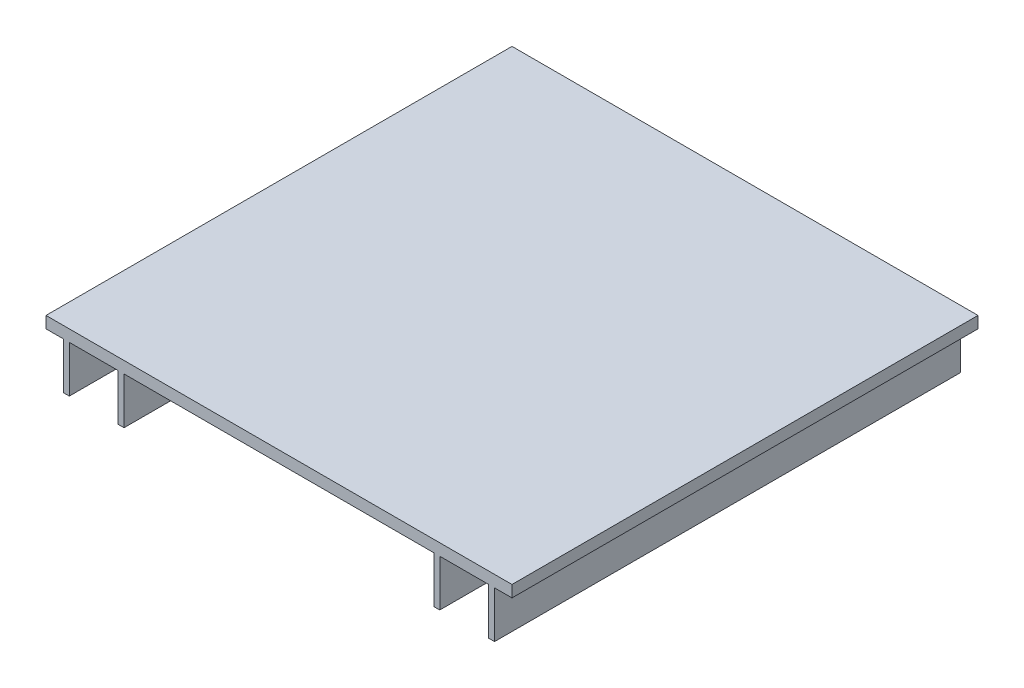
ISO-10303-21;
HEADER;
FILE_DESCRIPTION(('STEP AP214'),'2;1');
FILE_NAME('part.step','',(''),(''),'','','');
FILE_SCHEMA(('AUTOMOTIVE_DESIGN { 1 0 10303 214 1 1 1 1 }'));
ENDSEC;
DATA;
#1=APPLICATION_CONTEXT('core data for automotive mechanical design processes');
#2=APPLICATION_PROTOCOL_DEFINITION('international standard','automotive_design',2000,#1);
#3=PRODUCT_CONTEXT('',#1,'mechanical');
#4=PRODUCT('Part','Part','',(#3));
#5=PRODUCT_RELATED_PRODUCT_CATEGORY('part','',(#4));
#6=PRODUCT_DEFINITION_FORMATION('','',#4);
#7=PRODUCT_DEFINITION_CONTEXT('part definition',#1,'design');
#8=PRODUCT_DEFINITION('design','',#6,#7);
#9=PRODUCT_DEFINITION_SHAPE('','',#8);
#10=(LENGTH_UNIT() NAMED_UNIT(*) SI_UNIT(.MILLI.,.METRE.));
#11=(NAMED_UNIT(*) PLANE_ANGLE_UNIT() SI_UNIT($,.RADIAN.));
#12=(NAMED_UNIT(*) SI_UNIT($,.STERADIAN.) SOLID_ANGLE_UNIT());
#13=UNCERTAINTY_MEASURE_WITH_UNIT(LENGTH_MEASURE(1.E-05),#10,'distance_accuracy_value','');
#14=(GEOMETRIC_REPRESENTATION_CONTEXT(3) GLOBAL_UNCERTAINTY_ASSIGNED_CONTEXT((#13)) GLOBAL_UNIT_ASSIGNED_CONTEXT((#10,
#11,#12)) REPRESENTATION_CONTEXT('',''));
#15=CARTESIAN_POINT('',(0.,0.,0.));
#16=DIRECTION('',(0.,0.,1.));
#17=DIRECTION('',(1.,0.,0.));
#18=AXIS2_PLACEMENT_3D('',#15,#16,#17);
#19=CARTESIAN_POINT('',(0.,0.,0.));
#20=DIRECTION('',(0.,1.,0.));
#21=DIRECTION('',(0.,0.,1.));
#22=AXIS2_PLACEMENT_3D('',#19,#20,#21);
#23=PLANE('',#22);
#24=DIRECTION('',(-1.,0.,0.));
#25=VECTOR('',#24,1.);
#26=CARTESIAN_POINT('',(-100.,0.,-100.));
#27=LINE('',#26,#25);
#28=CARTESIAN_POINT('',(90.,0.,-100.));
#29=VERTEX_POINT('',#28);
#30=CARTESIAN_POINT('',(69.,0.,-100.));
#31=VERTEX_POINT('',#30);
#32=EDGE_CURVE('E360',#29,#31,#27,.T.);
#33=ORIENTED_EDGE('',*,*,#32,.F.);
#34=DIRECTION('',(0.,0.,1.));
#35=VECTOR('',#34,1.);
#36=CARTESIAN_POINT('',(90.,0.,100.));
#37=LINE('',#36,#35);
#38=CARTESIAN_POINT('',(90.,0.,100.));
#39=VERTEX_POINT('',#38);
#40=EDGE_CURVE('E220',#29,#39,#37,.T.);
#41=ORIENTED_EDGE('',*,*,#40,.T.);
#42=DIRECTION('',(1.,0.,0.));
#43=VECTOR('',#42,1.);
#44=CARTESIAN_POINT('',(-100.,0.,100.));
#45=LINE('',#44,#43);
#46=CARTESIAN_POINT('',(69.,0.,100.));
#47=VERTEX_POINT('',#46);
#48=EDGE_CURVE('E191',#47,#39,#45,.T.);
#49=ORIENTED_EDGE('',*,*,#48,.F.);
#50=DIRECTION('',(0.,0.,-1.));
#51=VECTOR('',#50,1.);
#52=CARTESIAN_POINT('',(69.,0.,100.));
#53=LINE('',#52,#51);
#54=EDGE_CURVE('E69',#47,#31,#53,.T.);
#55=ORIENTED_EDGE('',*,*,#54,.T.);
#56=EDGE_LOOP('',(#33,#41,#49,#55));
#57=FACE_BOUND('',#56,.T.);
#58=ADVANCED_FACE('F45',(#57),#23,.F.);
#59=CARTESIAN_POINT('',(66.5,0.,-100.));
#60=VERTEX_POINT('',#59);
#61=CARTESIAN_POINT('',(-66.5,0.,-100.));
#62=VERTEX_POINT('',#61);
#63=EDGE_CURVE('E432',#60,#62,#27,.T.);
#64=ORIENTED_EDGE('',*,*,#63,.F.);
#65=DIRECTION('',(0.,0.,1.));
#66=VECTOR('',#65,1.);
#67=CARTESIAN_POINT('',(66.5,0.,-100.));
#68=LINE('',#67,#66);
#69=CARTESIAN_POINT('',(66.5,0.,100.));
#70=VERTEX_POINT('',#69);
#71=EDGE_CURVE('E197',#60,#70,#68,.T.);
#72=ORIENTED_EDGE('',*,*,#71,.T.);
#73=CARTESIAN_POINT('',(-66.5,0.,100.));
#74=VERTEX_POINT('',#73);
#75=EDGE_CURVE('E368',#74,#70,#45,.T.);
#76=ORIENTED_EDGE('',*,*,#75,.F.);
#77=DIRECTION('',(0.,0.,1.));
#78=VECTOR('',#77,1.);
#79=CARTESIAN_POINT('',(-66.5,0.,-100.));
#80=LINE('',#79,#78);
#81=EDGE_CURVE('E304',#62,#74,#80,.T.);
#82=ORIENTED_EDGE('',*,*,#81,.F.);
#83=EDGE_LOOP('',(#64,#72,#76,#82));
#84=FACE_BOUND('',#83,.T.);
#85=ADVANCED_FACE('F431',(#84),#23,.F.);
#86=DIRECTION('',(0.,0.,-1.));
#87=VECTOR('',#86,1.);
#88=CARTESIAN_POINT('',(-92.5,0.,-100.));
#89=LINE('',#88,#87);
#90=CARTESIAN_POINT('',(-92.5,0.,100.));
#91=VERTEX_POINT('',#90);
#92=CARTESIAN_POINT('',(-92.5,0.,-100.));
#93=VERTEX_POINT('',#92);
#94=EDGE_CURVE('E283',#91,#93,#89,.T.);
#95=ORIENTED_EDGE('',*,*,#94,.F.);
#96=CARTESIAN_POINT('',(-100.,0.,100.));
#97=VERTEX_POINT('',#96);
#98=EDGE_CURVE('E341',#97,#91,#45,.T.);
#99=ORIENTED_EDGE('',*,*,#98,.F.);
#100=DIRECTION('',(0.,0.,1.));
#101=VECTOR('',#100,1.);
#102=CARTESIAN_POINT('',(-100.,0.,-100.));
#103=LINE('',#102,#101);
#104=CARTESIAN_POINT('',(-100.,0.,-100.));
#105=VERTEX_POINT('',#104);
#106=EDGE_CURVE('E359',#105,#97,#103,.T.);
#107=ORIENTED_EDGE('',*,*,#106,.F.);
#108=EDGE_CURVE('E354',#93,#105,#27,.T.);
#109=ORIENTED_EDGE('',*,*,#108,.F.);
#110=EDGE_LOOP('',(#95,#99,#107,#109));
#111=FACE_BOUND('',#110,.T.);
#112=ADVANCED_FACE('F388',(#111),#23,.F.);
#113=DIRECTION('',(0.,0.,1.));
#114=VECTOR('',#113,1.);
#115=CARTESIAN_POINT('',(-90.,0.,100.));
#116=LINE('',#115,#114);
#117=CARTESIAN_POINT('',(-90.,0.,-100.));
#118=VERTEX_POINT('',#117);
#119=CARTESIAN_POINT('',(-90.,0.,100.));
#120=VERTEX_POINT('',#119);
#121=EDGE_CURVE('E279',#118,#120,#116,.T.);
#122=ORIENTED_EDGE('',*,*,#121,.F.);
#123=CARTESIAN_POINT('',(-69.,0.,-100.));
#124=VERTEX_POINT('',#123);
#125=EDGE_CURVE('E361',#124,#118,#27,.T.);
#126=ORIENTED_EDGE('',*,*,#125,.F.);
#127=DIRECTION('',(0.,0.,-1.));
#128=VECTOR('',#127,1.);
#129=CARTESIAN_POINT('',(-69.,0.,100.));
#130=LINE('',#129,#128);
#131=CARTESIAN_POINT('',(-69.,0.,100.));
#132=VERTEX_POINT('',#131);
#133=EDGE_CURVE('E287',#132,#124,#130,.T.);
#134=ORIENTED_EDGE('',*,*,#133,.F.);
#135=EDGE_CURVE('E367',#120,#132,#45,.T.);
#136=ORIENTED_EDGE('',*,*,#135,.F.);
#137=EDGE_LOOP('',(#122,#126,#134,#136));
#138=FACE_BOUND('',#137,.T.);
#139=ADVANCED_FACE('F415',(#138),#23,.F.);
#140=CARTESIAN_POINT('',(92.5,0.,100.));
#141=VERTEX_POINT('',#140);
#142=CARTESIAN_POINT('',(100.,0.,100.));
#143=VERTEX_POINT('',#142);
#144=EDGE_CURVE('E364',#141,#143,#45,.T.);
#145=ORIENTED_EDGE('',*,*,#144,.F.);
#146=DIRECTION('',(0.,0.,-1.));
#147=VECTOR('',#146,1.);
#148=CARTESIAN_POINT('',(92.5,0.,-100.));
#149=LINE('',#148,#147);
#150=CARTESIAN_POINT('',(92.5,0.,-100.));
#151=VERTEX_POINT('',#150);
#152=EDGE_CURVE('E61',#141,#151,#149,.T.);
#153=ORIENTED_EDGE('',*,*,#152,.T.);
#154=CARTESIAN_POINT('',(100.,0.,-100.));
#155=VERTEX_POINT('',#154);
#156=EDGE_CURVE('E355',#155,#151,#27,.T.);
#157=ORIENTED_EDGE('',*,*,#156,.F.);
#158=DIRECTION('',(0.,0.,-1.));
#159=VECTOR('',#158,1.);
#160=CARTESIAN_POINT('',(100.,0.,-100.));
#161=LINE('',#160,#159);
#162=EDGE_CURVE('E335',#143,#155,#161,.T.);
#163=ORIENTED_EDGE('',*,*,#162,.F.);
#164=EDGE_LOOP('',(#145,#153,#157,#163));
#165=FACE_BOUND('',#164,.T.);
#166=ADVANCED_FACE('F402',(#165),#23,.F.);
#167=CARTESIAN_POINT('',(100.,5.,-100.));
#168=DIRECTION('',(-1.,0.,0.));
#169=DIRECTION('',(0.,0.,1.));
#170=AXIS2_PLACEMENT_3D('',#167,#168,#169);
#171=PLANE('',#170);
#172=ORIENTED_EDGE('',*,*,#162,.T.);
#173=DIRECTION('',(0.,-1.,0.));
#174=VECTOR('',#173,1.);
#175=CARTESIAN_POINT('',(100.,5.,-100.));
#176=LINE('',#175,#174);
#177=CARTESIAN_POINT('',(100.,5.,-100.));
#178=VERTEX_POINT('',#177);
#179=EDGE_CURVE('E11',#178,#155,#176,.T.);
#180=ORIENTED_EDGE('',*,*,#179,.F.);
#181=DIRECTION('',(0.,0.,-1.));
#182=VECTOR('',#181,1.);
#183=CARTESIAN_POINT('',(100.,5.,-100.));
#184=LINE('',#183,#182);
#185=CARTESIAN_POINT('',(100.,5.,100.));
#186=VERTEX_POINT('',#185);
#187=EDGE_CURVE('E336',#186,#178,#184,.T.);
#188=ORIENTED_EDGE('',*,*,#187,.F.);
#189=DIRECTION('',(0.,-1.,0.));
#190=VECTOR('',#189,1.);
#191=CARTESIAN_POINT('',(100.,5.,100.));
#192=LINE('',#191,#190);
#193=EDGE_CURVE('E350',#186,#143,#192,.T.);
#194=ORIENTED_EDGE('',*,*,#193,.T.);
#195=EDGE_LOOP('',(#172,#180,#188,#194));
#196=FACE_BOUND('',#195,.T.);
#197=ADVANCED_FACE('F47',(#196),#171,.F.);
#198=CARTESIAN_POINT('',(-100.,5.,-100.));
#199=DIRECTION('',(0.,0.,1.));
#200=DIRECTION('',(1.,0.,0.));
#201=AXIS2_PLACEMENT_3D('',#198,#199,#200);
#202=PLANE('',#201);
#203=ORIENTED_EDGE('',*,*,#156,.T.);
#204=DIRECTION('',(0.,1.,0.));
#205=VECTOR('',#204,1.);
#206=CARTESIAN_POINT('',(92.5,-20.,-100.));
#207=LINE('',#206,#205);
#208=CARTESIAN_POINT('',(92.5,-20.,-100.));
#209=VERTEX_POINT('',#208);
#210=EDGE_CURVE('E227',#209,#151,#207,.T.);
#211=ORIENTED_EDGE('',*,*,#210,.F.);
#212=DIRECTION('',(-1.,0.,0.));
#213=VECTOR('',#212,1.);
#214=CARTESIAN_POINT('',(92.5,-20.,-100.));
#215=LINE('',#214,#213);
#216=CARTESIAN_POINT('',(90.,-20.,-100.));
#217=VERTEX_POINT('',#216);
#218=EDGE_CURVE('E212',#209,#217,#215,.T.);
#219=ORIENTED_EDGE('',*,*,#218,.T.);
#220=DIRECTION('',(0.,1.,0.));
#221=VECTOR('',#220,1.);
#222=CARTESIAN_POINT('',(90.,-20.,-100.));
#223=LINE('',#222,#221);
#224=EDGE_CURVE('E198',#217,#29,#223,.T.);
#225=ORIENTED_EDGE('',*,*,#224,.T.);
#226=ORIENTED_EDGE('',*,*,#32,.T.);
#227=DIRECTION('',(0.,1.,0.));
#228=VECTOR('',#227,1.);
#229=CARTESIAN_POINT('',(69.,-20.,-100.));
#230=LINE('',#229,#228);
#231=CARTESIAN_POINT('',(69.,-20.,-100.));
#232=VERTEX_POINT('',#231);
#233=EDGE_CURVE('E256',#232,#31,#230,.T.);
#234=ORIENTED_EDGE('',*,*,#233,.F.);
#235=DIRECTION('',(-1.,0.,0.));
#236=VECTOR('',#235,1.);
#237=CARTESIAN_POINT('',(69.,-20.,-100.));
#238=LINE('',#237,#236);
#239=CARTESIAN_POINT('',(66.5,-20.,-100.));
#240=VERTEX_POINT('',#239);
#241=EDGE_CURVE('E240',#232,#240,#238,.T.);
#242=ORIENTED_EDGE('',*,*,#241,.T.);
#243=DIRECTION('',(0.,1.,0.));
#244=VECTOR('',#243,1.);
#245=CARTESIAN_POINT('',(66.5,-20.,-100.));
#246=LINE('',#245,#244);
#247=EDGE_CURVE('E259',#240,#60,#246,.T.);
#248=ORIENTED_EDGE('',*,*,#247,.T.);
#249=ORIENTED_EDGE('',*,*,#63,.T.);
#250=DIRECTION('',(0.,1.,0.));
#251=VECTOR('',#250,1.);
#252=CARTESIAN_POINT('',(-66.5,-20.,-100.));
#253=LINE('',#252,#251);
#254=CARTESIAN_POINT('',(-66.5,-20.,-100.));
#255=VERTEX_POINT('',#254);
#256=EDGE_CURVE('E323',#255,#62,#253,.T.);
#257=ORIENTED_EDGE('',*,*,#256,.F.);
#258=DIRECTION('',(1.,0.,0.));
#259=VECTOR('',#258,1.);
#260=CARTESIAN_POINT('',(-69.,-20.,-100.));
#261=LINE('',#260,#259);
#262=CARTESIAN_POINT('',(-69.,-20.,-100.));
#263=VERTEX_POINT('',#262);
#264=EDGE_CURVE('E307',#263,#255,#261,.T.);
#265=ORIENTED_EDGE('',*,*,#264,.F.);
#266=DIRECTION('',(0.,1.,0.));
#267=VECTOR('',#266,1.);
#268=CARTESIAN_POINT('',(-69.,-20.,-100.));
#269=LINE('',#268,#267);
#270=EDGE_CURVE('E327',#263,#124,#269,.T.);
#271=ORIENTED_EDGE('',*,*,#270,.T.);
#272=ORIENTED_EDGE('',*,*,#125,.T.);
#273=DIRECTION('',(0.,1.,0.));
#274=VECTOR('',#273,1.);
#275=CARTESIAN_POINT('',(-90.,-20.,-100.));
#276=LINE('',#275,#274);
#277=CARTESIAN_POINT('',(-90.,-20.,-100.));
#278=VERTEX_POINT('',#277);
#279=EDGE_CURVE('E272',#278,#118,#276,.T.);
#280=ORIENTED_EDGE('',*,*,#279,.F.);
#281=DIRECTION('',(1.,0.,0.));
#282=VECTOR('',#281,1.);
#283=CARTESIAN_POINT('',(-92.5,-20.,-100.));
#284=LINE('',#283,#282);
#285=CARTESIAN_POINT('',(-92.5,-20.,-100.));
#286=VERTEX_POINT('',#285);
#287=EDGE_CURVE('E290',#286,#278,#284,.T.);
#288=ORIENTED_EDGE('',*,*,#287,.F.);
#289=DIRECTION('',(0.,1.,0.));
#290=VECTOR('',#289,1.);
#291=CARTESIAN_POINT('',(-92.5,-20.,-100.));
#292=LINE('',#291,#290);
#293=EDGE_CURVE('E268',#286,#93,#292,.T.);
#294=ORIENTED_EDGE('',*,*,#293,.T.);
#295=ORIENTED_EDGE('',*,*,#108,.T.);
#296=DIRECTION('',(0.,-1.,0.));
#297=VECTOR('',#296,1.);
#298=CARTESIAN_POINT('',(-100.,5.,-100.));
#299=LINE('',#298,#297);
#300=CARTESIAN_POINT('',(-100.,5.,-100.));
#301=VERTEX_POINT('',#300);
#302=EDGE_CURVE('E54',#301,#105,#299,.T.);
#303=ORIENTED_EDGE('',*,*,#302,.F.);
#304=DIRECTION('',(-1.,0.,0.));
#305=VECTOR('',#304,1.);
#306=CARTESIAN_POINT('',(-100.,5.,-100.));
#307=LINE('',#306,#305);
#308=EDGE_CURVE('E340',#178,#301,#307,.T.);
#309=ORIENTED_EDGE('',*,*,#308,.F.);
#310=ORIENTED_EDGE('',*,*,#179,.T.);
#311=EDGE_LOOP('',(#203,#211,#219,#225,#226,#234,#242,#248,#249,#257,#265,#271,#272,#280,#288,
#294,#295,#303,#309,#310));
#312=FACE_BOUND('',#311,.T.);
#313=ADVANCED_FACE('F397',(#312),#202,.F.);
#314=CARTESIAN_POINT('',(-100.,5.,-100.));
#315=DIRECTION('',(1.,0.,0.));
#316=DIRECTION('',(0.,0.,-1.));
#317=AXIS2_PLACEMENT_3D('',#314,#315,#316);
#318=PLANE('',#317);
#319=ORIENTED_EDGE('',*,*,#106,.T.);
#320=DIRECTION('',(0.,-1.,0.));
#321=VECTOR('',#320,1.);
#322=CARTESIAN_POINT('',(-100.,5.,100.));
#323=LINE('',#322,#321);
#324=CARTESIAN_POINT('',(-100.,5.,100.));
#325=VERTEX_POINT('',#324);
#326=EDGE_CURVE('E372',#325,#97,#323,.T.);
#327=ORIENTED_EDGE('',*,*,#326,.F.);
#328=DIRECTION('',(0.,0.,1.));
#329=VECTOR('',#328,1.);
#330=CARTESIAN_POINT('',(-100.,5.,-100.));
#331=LINE('',#330,#329);
#332=EDGE_CURVE('E344',#301,#325,#331,.T.);
#333=ORIENTED_EDGE('',*,*,#332,.F.);
#334=ORIENTED_EDGE('',*,*,#302,.T.);
#335=EDGE_LOOP('',(#319,#327,#333,#334));
#336=FACE_BOUND('',#335,.T.);
#337=ADVANCED_FACE('F381',(#336),#318,.F.);
#338=CARTESIAN_POINT('',(-100.,5.,100.));
#339=DIRECTION('',(0.,0.,-1.));
#340=DIRECTION('',(-1.,0.,0.));
#341=AXIS2_PLACEMENT_3D('',#338,#339,#340);
#342=PLANE('',#341);
#343=ORIENTED_EDGE('',*,*,#98,.T.);
#344=DIRECTION('',(0.,1.,0.));
#345=VECTOR('',#344,1.);
#346=CARTESIAN_POINT('',(-92.5,-20.,100.));
#347=LINE('',#346,#345);
#348=CARTESIAN_POINT('',(-92.5,-20.,100.));
#349=VERTEX_POINT('',#348);
#350=EDGE_CURVE('E265',#349,#91,#347,.T.);
#351=ORIENTED_EDGE('',*,*,#350,.F.);
#352=DIRECTION('',(-1.,0.,0.));
#353=VECTOR('',#352,1.);
#354=CARTESIAN_POINT('',(-92.5,-20.,100.));
#355=LINE('',#354,#353);
#356=CARTESIAN_POINT('',(-90.,-20.,100.));
#357=VERTEX_POINT('',#356);
#358=EDGE_CURVE('E284',#357,#349,#355,.T.);
#359=ORIENTED_EDGE('',*,*,#358,.F.);
#360=DIRECTION('',(0.,1.,0.));
#361=VECTOR('',#360,1.);
#362=CARTESIAN_POINT('',(-90.,-20.,100.));
#363=LINE('',#362,#361);
#364=EDGE_CURVE('E275',#357,#120,#363,.T.);
#365=ORIENTED_EDGE('',*,*,#364,.T.);
#366=ORIENTED_EDGE('',*,*,#135,.T.);
#367=DIRECTION('',(0.,1.,0.));
#368=VECTOR('',#367,1.);
#369=CARTESIAN_POINT('',(-69.,-20.,100.));
#370=LINE('',#369,#368);
#371=CARTESIAN_POINT('',(-69.,-20.,100.));
#372=VERTEX_POINT('',#371);
#373=EDGE_CURVE('E331',#372,#132,#370,.T.);
#374=ORIENTED_EDGE('',*,*,#373,.F.);
#375=DIRECTION('',(-1.,0.,0.));
#376=VECTOR('',#375,1.);
#377=CARTESIAN_POINT('',(-66.5,-20.,100.));
#378=LINE('',#377,#376);
#379=CARTESIAN_POINT('',(-66.5,-20.,100.));
#380=VERTEX_POINT('',#379);
#381=EDGE_CURVE('E299',#380,#372,#378,.T.);
#382=ORIENTED_EDGE('',*,*,#381,.F.);
#383=DIRECTION('',(0.,1.,0.));
#384=VECTOR('',#383,1.);
#385=CARTESIAN_POINT('',(-66.5,-20.,100.));
#386=LINE('',#385,#384);
#387=EDGE_CURVE('E313',#380,#74,#386,.T.);
#388=ORIENTED_EDGE('',*,*,#387,.T.);
#389=ORIENTED_EDGE('',*,*,#75,.T.);
#390=DIRECTION('',(0.,1.,0.));
#391=VECTOR('',#390,1.);
#392=CARTESIAN_POINT('',(66.5,-20.,100.));
#393=LINE('',#392,#391);
#394=CARTESIAN_POINT('',(66.5,-20.,100.));
#395=VERTEX_POINT('',#394);
#396=EDGE_CURVE('E262',#395,#70,#393,.T.);
#397=ORIENTED_EDGE('',*,*,#396,.F.);
#398=DIRECTION('',(1.,0.,0.));
#399=VECTOR('',#398,1.);
#400=CARTESIAN_POINT('',(66.5,-20.,100.));
#401=LINE('',#400,#399);
#402=CARTESIAN_POINT('',(69.,-20.,100.));
#403=VERTEX_POINT('',#402);
#404=EDGE_CURVE('E232',#395,#403,#401,.T.);
#405=ORIENTED_EDGE('',*,*,#404,.T.);
#406=DIRECTION('',(0.,1.,0.));
#407=VECTOR('',#406,1.);
#408=CARTESIAN_POINT('',(69.,-20.,100.));
#409=LINE('',#408,#407);
#410=EDGE_CURVE('E248',#403,#47,#409,.T.);
#411=ORIENTED_EDGE('',*,*,#410,.T.);
#412=ORIENTED_EDGE('',*,*,#48,.T.);
#413=DIRECTION('',(0.,1.,0.));
#414=VECTOR('',#413,1.);
#415=CARTESIAN_POINT('',(90.,-20.,100.));
#416=LINE('',#415,#414);
#417=CARTESIAN_POINT('',(90.,-20.,100.));
#418=VERTEX_POINT('',#417);
#419=EDGE_CURVE('E184',#418,#39,#416,.T.);
#420=ORIENTED_EDGE('',*,*,#419,.F.);
#421=DIRECTION('',(1.,0.,0.));
#422=VECTOR('',#421,1.);
#423=CARTESIAN_POINT('',(92.5,-20.,100.));
#424=LINE('',#423,#422);
#425=CARTESIAN_POINT('',(92.5,-20.,100.));
#426=VERTEX_POINT('',#425);
#427=EDGE_CURVE('E188',#418,#426,#424,.T.);
#428=ORIENTED_EDGE('',*,*,#427,.T.);
#429=DIRECTION('',(0.,1.,0.));
#430=VECTOR('',#429,1.);
#431=CARTESIAN_POINT('',(92.5,-20.,100.));
#432=LINE('',#431,#430);
#433=EDGE_CURVE('E219',#426,#141,#432,.T.);
#434=ORIENTED_EDGE('',*,*,#433,.T.);
#435=ORIENTED_EDGE('',*,*,#144,.T.);
#436=ORIENTED_EDGE('',*,*,#193,.F.);
#437=DIRECTION('',(1.,0.,0.));
#438=VECTOR('',#437,1.);
#439=CARTESIAN_POINT('',(-100.,5.,100.));
#440=LINE('',#439,#438);
#441=EDGE_CURVE('E347',#325,#186,#440,.T.);
#442=ORIENTED_EDGE('',*,*,#441,.F.);
#443=ORIENTED_EDGE('',*,*,#326,.T.);
#444=EDGE_LOOP('',(#343,#351,#359,#365,#366,#374,#382,#388,#389,#397,#405,#411,#412,#420,#428,
#434,#435,#436,#442,#443));
#445=FACE_BOUND('',#444,.T.);
#446=ADVANCED_FACE('F187',(#445),#342,.F.);
#447=CARTESIAN_POINT('',(0.,5.,0.));
#448=DIRECTION('',(0.,1.,0.));
#449=DIRECTION('',(0.,0.,1.));
#450=AXIS2_PLACEMENT_3D('',#447,#448,#449);
#451=PLANE('',#450);
#452=ORIENTED_EDGE('',*,*,#187,.T.);
#453=ORIENTED_EDGE('',*,*,#308,.T.);
#454=ORIENTED_EDGE('',*,*,#332,.T.);
#455=ORIENTED_EDGE('',*,*,#441,.T.);
#456=EDGE_LOOP('',(#452,#453,#454,#455));
#457=FACE_BOUND('',#456,.T.);
#458=ADVANCED_FACE('F395',(#457),#451,.T.);
#459=CARTESIAN_POINT('',(-69.,-20.,100.));
#460=DIRECTION('',(1.,0.,0.));
#461=DIRECTION('',(0.,0.,-1.));
#462=AXIS2_PLACEMENT_3D('',#459,#460,#461);
#463=PLANE('',#462);
#464=ORIENTED_EDGE('',*,*,#133,.T.);
#465=ORIENTED_EDGE('',*,*,#270,.F.);
#466=DIRECTION('',(0.,0.,-1.));
#467=VECTOR('',#466,1.);
#468=CARTESIAN_POINT('',(-69.,-20.,100.));
#469=LINE('',#468,#467);
#470=EDGE_CURVE('E303',#372,#263,#469,.T.);
#471=ORIENTED_EDGE('',*,*,#470,.F.);
#472=ORIENTED_EDGE('',*,*,#373,.T.);
#473=EDGE_LOOP('',(#464,#465,#471,#472));
#474=FACE_BOUND('',#473,.T.);
#475=ADVANCED_FACE('F419',(#474),#463,.F.);
#476=CARTESIAN_POINT('',(-66.5,-20.,-100.));
#477=DIRECTION('',(-1.,0.,0.));
#478=DIRECTION('',(0.,0.,1.));
#479=AXIS2_PLACEMENT_3D('',#476,#477,#478);
#480=PLANE('',#479);
#481=ORIENTED_EDGE('',*,*,#81,.T.);
#482=ORIENTED_EDGE('',*,*,#387,.F.);
#483=DIRECTION('',(0.,0.,1.));
#484=VECTOR('',#483,1.);
#485=CARTESIAN_POINT('',(-66.5,-20.,-100.));
#486=LINE('',#485,#484);
#487=EDGE_CURVE('E310',#255,#380,#486,.T.);
#488=ORIENTED_EDGE('',*,*,#487,.F.);
#489=ORIENTED_EDGE('',*,*,#256,.T.);
#490=EDGE_LOOP('',(#481,#482,#488,#489));
#491=FACE_BOUND('',#490,.T.);
#492=ADVANCED_FACE('F426',(#491),#480,.F.);
#493=CARTESIAN_POINT('',(0.,-20.,0.));
#494=DIRECTION('',(0.,-1.,0.));
#495=DIRECTION('',(0.,0.,-1.));
#496=AXIS2_PLACEMENT_3D('',#493,#494,#495);
#497=PLANE('',#496);
#498=ORIENTED_EDGE('',*,*,#381,.T.);
#499=ORIENTED_EDGE('',*,*,#470,.T.);
#500=ORIENTED_EDGE('',*,*,#264,.T.);
#501=ORIENTED_EDGE('',*,*,#487,.T.);
#502=EDGE_LOOP('',(#498,#499,#500,#501));
#503=FACE_BOUND('',#502,.T.);
#504=ADVANCED_FACE('F422',(#503),#497,.T.);
#505=CARTESIAN_POINT('',(-92.5,-20.,-100.));
#506=DIRECTION('',(1.,0.,0.));
#507=DIRECTION('',(0.,0.,-1.));
#508=AXIS2_PLACEMENT_3D('',#505,#506,#507);
#509=PLANE('',#508);
#510=ORIENTED_EDGE('',*,*,#94,.T.);
#511=ORIENTED_EDGE('',*,*,#293,.F.);
#512=DIRECTION('',(0.,0.,-1.));
#513=VECTOR('',#512,1.);
#514=CARTESIAN_POINT('',(-92.5,-20.,-100.));
#515=LINE('',#514,#513);
#516=EDGE_CURVE('E293',#349,#286,#515,.T.);
#517=ORIENTED_EDGE('',*,*,#516,.F.);
#518=ORIENTED_EDGE('',*,*,#350,.T.);
#519=EDGE_LOOP('',(#510,#511,#517,#518));
#520=FACE_BOUND('',#519,.T.);
#521=ADVANCED_FACE('F453',(#520),#509,.F.);
#522=CARTESIAN_POINT('',(-90.,-20.,100.));
#523=DIRECTION('',(-1.,0.,0.));
#524=DIRECTION('',(0.,0.,1.));
#525=AXIS2_PLACEMENT_3D('',#522,#523,#524);
#526=PLANE('',#525);
#527=ORIENTED_EDGE('',*,*,#121,.T.);
#528=ORIENTED_EDGE('',*,*,#364,.F.);
#529=DIRECTION('',(0.,0.,1.));
#530=VECTOR('',#529,1.);
#531=CARTESIAN_POINT('',(-90.,-20.,100.));
#532=LINE('',#531,#530);
#533=EDGE_CURVE('E278',#278,#357,#532,.T.);
#534=ORIENTED_EDGE('',*,*,#533,.F.);
#535=ORIENTED_EDGE('',*,*,#279,.T.);
#536=EDGE_LOOP('',(#527,#528,#534,#535));
#537=FACE_BOUND('',#536,.T.);
#538=ADVANCED_FACE('F458',(#537),#526,.F.);
#539=CARTESIAN_POINT('',(0.,-20.,0.));
#540=DIRECTION('',(0.,1.,0.));
#541=DIRECTION('',(0.,0.,1.));
#542=AXIS2_PLACEMENT_3D('',#539,#540,#541);
#543=PLANE('',#542);
#544=ORIENTED_EDGE('',*,*,#358,.T.);
#545=ORIENTED_EDGE('',*,*,#516,.T.);
#546=ORIENTED_EDGE('',*,*,#287,.T.);
#547=ORIENTED_EDGE('',*,*,#533,.T.);
#548=EDGE_LOOP('',(#544,#545,#546,#547));
#549=FACE_BOUND('',#548,.T.);
#550=ADVANCED_FACE('F455',(#549),#543,.F.);
#551=CARTESIAN_POINT('',(66.5,-20.,-100.));
#552=DIRECTION('',(-1.,0.,0.));
#553=DIRECTION('',(0.,0.,1.));
#554=AXIS2_PLACEMENT_3D('',#551,#552,#553);
#555=PLANE('',#554);
#556=ORIENTED_EDGE('',*,*,#71,.F.);
#557=ORIENTED_EDGE('',*,*,#247,.F.);
#558=DIRECTION('',(0.,0.,1.));
#559=VECTOR('',#558,1.);
#560=CARTESIAN_POINT('',(66.5,-20.,-100.));
#561=LINE('',#560,#559);
#562=EDGE_CURVE('E236',#240,#395,#561,.T.);
#563=ORIENTED_EDGE('',*,*,#562,.T.);
#564=ORIENTED_EDGE('',*,*,#396,.T.);
#565=EDGE_LOOP('',(#556,#557,#563,#564));
#566=FACE_BOUND('',#565,.T.);
#567=ADVANCED_FACE('F435',(#566),#555,.T.);
#568=CARTESIAN_POINT('',(69.,-20.,100.));
#569=DIRECTION('',(1.,0.,0.));
#570=DIRECTION('',(0.,0.,-1.));
#571=AXIS2_PLACEMENT_3D('',#568,#569,#570);
#572=PLANE('',#571);
#573=ORIENTED_EDGE('',*,*,#54,.F.);
#574=ORIENTED_EDGE('',*,*,#410,.F.);
#575=DIRECTION('',(0.,0.,-1.));
#576=VECTOR('',#575,1.);
#577=CARTESIAN_POINT('',(69.,-20.,100.));
#578=LINE('',#577,#576);
#579=EDGE_CURVE('E244',#403,#232,#578,.T.);
#580=ORIENTED_EDGE('',*,*,#579,.T.);
#581=ORIENTED_EDGE('',*,*,#233,.T.);
#582=EDGE_LOOP('',(#573,#574,#580,#581));
#583=FACE_BOUND('',#582,.T.);
#584=ADVANCED_FACE('F442',(#583),#572,.T.);
#585=CARTESIAN_POINT('',(0.,-20.,0.));
#586=DIRECTION('',(0.,-1.,0.));
#587=DIRECTION('',(0.,0.,-1.));
#588=AXIS2_PLACEMENT_3D('',#585,#586,#587);
#589=PLANE('',#588);
#590=ORIENTED_EDGE('',*,*,#404,.F.);
#591=ORIENTED_EDGE('',*,*,#562,.F.);
#592=ORIENTED_EDGE('',*,*,#241,.F.);
#593=ORIENTED_EDGE('',*,*,#579,.F.);
#594=EDGE_LOOP('',(#590,#591,#592,#593));
#595=FACE_BOUND('',#594,.T.);
#596=ADVANCED_FACE('F440',(#595),#589,.T.);
#597=CARTESIAN_POINT('',(90.,-20.,100.));
#598=DIRECTION('',(-1.,0.,0.));
#599=DIRECTION('',(0.,0.,1.));
#600=AXIS2_PLACEMENT_3D('',#597,#598,#599);
#601=PLANE('',#600);
#602=ORIENTED_EDGE('',*,*,#40,.F.);
#603=ORIENTED_EDGE('',*,*,#224,.F.);
#604=DIRECTION('',(0.,0.,1.));
#605=VECTOR('',#604,1.);
#606=CARTESIAN_POINT('',(90.,-20.,100.));
#607=LINE('',#606,#605);
#608=EDGE_CURVE('E204',#217,#418,#607,.T.);
#609=ORIENTED_EDGE('',*,*,#608,.T.);
#610=ORIENTED_EDGE('',*,*,#419,.T.);
#611=EDGE_LOOP('',(#602,#603,#609,#610));
#612=FACE_BOUND('',#611,.T.);
#613=ADVANCED_FACE('F210',(#612),#601,.T.);
#614=CARTESIAN_POINT('',(92.5,-20.,-100.));
#615=DIRECTION('',(1.,0.,0.));
#616=DIRECTION('',(0.,0.,-1.));
#617=AXIS2_PLACEMENT_3D('',#614,#615,#616);
#618=PLANE('',#617);
#619=ORIENTED_EDGE('',*,*,#152,.F.);
#620=ORIENTED_EDGE('',*,*,#433,.F.);
#621=DIRECTION('',(0.,0.,-1.));
#622=VECTOR('',#621,1.);
#623=CARTESIAN_POINT('',(92.5,-20.,-100.));
#624=LINE('',#623,#622);
#625=EDGE_CURVE('E207',#426,#209,#624,.T.);
#626=ORIENTED_EDGE('',*,*,#625,.T.);
#627=ORIENTED_EDGE('',*,*,#210,.T.);
#628=EDGE_LOOP('',(#619,#620,#626,#627));
#629=FACE_BOUND('',#628,.T.);
#630=ADVANCED_FACE('F614',(#629),#618,.T.);
#631=CARTESIAN_POINT('',(0.,-20.,0.));
#632=DIRECTION('',(0.,1.,0.));
#633=DIRECTION('',(0.,0.,1.));
#634=AXIS2_PLACEMENT_3D('',#631,#632,#633);
#635=PLANE('',#634);
#636=ORIENTED_EDGE('',*,*,#427,.F.);
#637=ORIENTED_EDGE('',*,*,#608,.F.);
#638=ORIENTED_EDGE('',*,*,#218,.F.);
#639=ORIENTED_EDGE('',*,*,#625,.F.);
#640=EDGE_LOOP('',(#636,#637,#638,#639));
#641=FACE_BOUND('',#640,.T.);
#642=ADVANCED_FACE('F202',(#641),#635,.F.);
#643=CLOSED_SHELL('',(#58,#85,#112,#139,#166,#197,#313,#337,#446,#458,#475,#492,#504,#521,#538,
#550,#567,#584,#596,#613,#630,#642));
#644=MANIFOLD_SOLID_BREP('B2',#643);
#645=ADVANCED_BREP_SHAPE_REPRESENTATION('',(#18,#644),#14);
#646=SHAPE_DEFINITION_REPRESENTATION(#9,#645);
ENDSEC;
END-ISO-10303-21;
